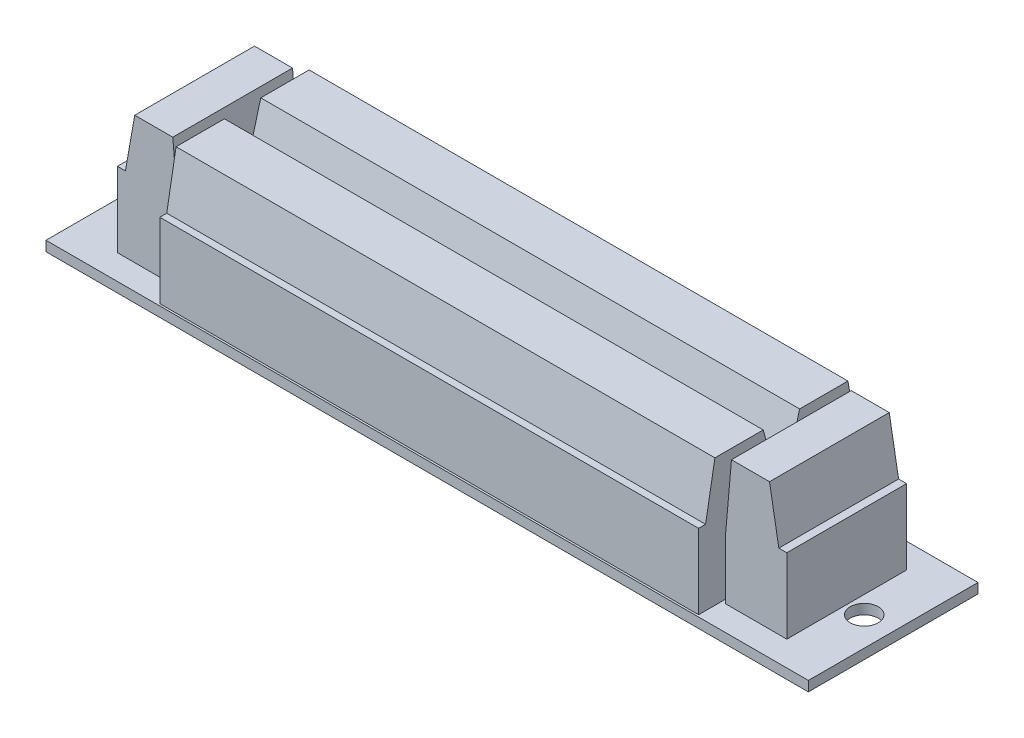
ISO-10303-21;
HEADER;
FILE_DESCRIPTION(('STEP AP214'),'2;1');
FILE_NAME('part.step','',(''),(''),'','','');
FILE_SCHEMA(('AUTOMOTIVE_DESIGN { 1 0 10303 214 1 1 1 1 }'));
ENDSEC;
DATA;
#1=APPLICATION_CONTEXT('core data for automotive mechanical design processes');
#2=APPLICATION_PROTOCOL_DEFINITION('international standard','automotive_design',2000,#1);
#3=PRODUCT_CONTEXT('',#1,'mechanical');
#4=PRODUCT('Part','Part','',(#3));
#5=PRODUCT_RELATED_PRODUCT_CATEGORY('part','',(#4));
#6=PRODUCT_DEFINITION_FORMATION('','',#4);
#7=PRODUCT_DEFINITION_CONTEXT('part definition',#1,'design');
#8=PRODUCT_DEFINITION('design','',#6,#7);
#9=PRODUCT_DEFINITION_SHAPE('','',#8);
#10=(LENGTH_UNIT() NAMED_UNIT(*) SI_UNIT(.MILLI.,.METRE.));
#11=(NAMED_UNIT(*) PLANE_ANGLE_UNIT() SI_UNIT($,.RADIAN.));
#12=(NAMED_UNIT(*) SI_UNIT($,.STERADIAN.) SOLID_ANGLE_UNIT());
#13=UNCERTAINTY_MEASURE_WITH_UNIT(LENGTH_MEASURE(1.E-05),#10,'distance_accuracy_value','');
#14=(GEOMETRIC_REPRESENTATION_CONTEXT(3) GLOBAL_UNCERTAINTY_ASSIGNED_CONTEXT((#13)) GLOBAL_UNIT_ASSIGNED_CONTEXT((#10,
#11,#12)) REPRESENTATION_CONTEXT('',''));
#15=CARTESIAN_POINT('',(0.,0.,0.));
#16=DIRECTION('',(0.,0.,1.));
#17=DIRECTION('',(1.,0.,0.));
#18=AXIS2_PLACEMENT_3D('',#15,#16,#17);
#19=CARTESIAN_POINT('',(0.,0.635,0.));
#20=DIRECTION('',(0.,1.,0.));
#21=DIRECTION('',(0.,0.,1.));
#22=AXIS2_PLACEMENT_3D('',#19,#20,#21);
#23=PLANE('',#22);
#24=DIRECTION('',(-1.,0.,0.));
#25=VECTOR('',#24,1.);
#26=CARTESIAN_POINT('',(42.5964285544107,0.635,7.62));
#27=LINE('',#26,#25);
#28=CARTESIAN_POINT('',(42.5964285544107,0.635,7.62));
#29=VERTEX_POINT('',#28);
#30=CARTESIAN_POINT('',(34.798,0.635,7.62));
#31=VERTEX_POINT('',#30);
#32=EDGE_CURVE('E245',#29,#31,#27,.T.);
#33=ORIENTED_EDGE('',*,*,#32,.T.);
#34=DIRECTION('',(0.,0.,-1.));
#35=VECTOR('',#34,1.);
#36=CARTESIAN_POINT('',(34.798,0.635,7.62));
#37=LINE('',#36,#35);
#38=CARTESIAN_POINT('',(34.798,0.635,-7.62));
#39=VERTEX_POINT('',#38);
#40=EDGE_CURVE('E1044',#31,#39,#37,.T.);
#41=ORIENTED_EDGE('',*,*,#40,.T.);
#42=DIRECTION('',(-1.,0.,0.));
#43=VECTOR('',#42,1.);
#44=CARTESIAN_POINT('',(42.5964285544107,0.635,-7.62));
#45=LINE('',#44,#43);
#46=CARTESIAN_POINT('',(42.5964285544107,0.635,-7.62));
#47=VERTEX_POINT('',#46);
#48=EDGE_CURVE('E269',#47,#39,#45,.T.);
#49=ORIENTED_EDGE('',*,*,#48,.F.);
#50=DIRECTION('',(0.,0.,-1.));
#51=VECTOR('',#50,1.);
#52=CARTESIAN_POINT('',(42.5964285544107,0.635,7.62));
#53=LINE('',#52,#51);
#54=EDGE_CURVE('E262',#29,#47,#53,.T.);
#55=ORIENTED_EDGE('',*,*,#54,.F.);
#56=EDGE_LOOP('',(#33,#41,#49,#55));
#57=FACE_BOUND('',#56,.T.);
#58=DIRECTION('',(1.,0.,0.));
#59=VECTOR('',#58,1.);
#60=CARTESIAN_POINT('',(-42.5964285544107,0.635,7.62));
#61=LINE('',#60,#59);
#62=CARTESIAN_POINT('',(-42.5964285544107,0.635,7.62));
#63=VERTEX_POINT('',#62);
#64=CARTESIAN_POINT('',(-34.798,0.635,7.62));
#65=VERTEX_POINT('',#64);
#66=EDGE_CURVE('E282',#63,#65,#61,.T.);
#67=ORIENTED_EDGE('',*,*,#66,.F.);
#68=DIRECTION('',(0.,0.,-1.));
#69=VECTOR('',#68,1.);
#70=CARTESIAN_POINT('',(-42.5964285544107,0.635,7.62));
#71=LINE('',#70,#69);
#72=CARTESIAN_POINT('',(-42.5964285544107,0.635,-7.62));
#73=VERTEX_POINT('',#72);
#74=EDGE_CURVE('E304',#63,#73,#71,.T.);
#75=ORIENTED_EDGE('',*,*,#74,.T.);
#76=DIRECTION('',(1.,0.,0.));
#77=VECTOR('',#76,1.);
#78=CARTESIAN_POINT('',(-42.5964285544107,0.635,-7.62));
#79=LINE('',#78,#77);
#80=CARTESIAN_POINT('',(-34.798,0.635,-7.62));
#81=VERTEX_POINT('',#80);
#82=EDGE_CURVE('E271',#73,#81,#79,.T.);
#83=ORIENTED_EDGE('',*,*,#82,.T.);
#84=DIRECTION('',(0.,0.,-1.));
#85=VECTOR('',#84,1.);
#86=CARTESIAN_POINT('',(-34.798,0.635,7.62));
#87=LINE('',#86,#85);
#88=EDGE_CURVE('E75',#65,#81,#87,.T.);
#89=ORIENTED_EDGE('',*,*,#88,.F.);
#90=EDGE_LOOP('',(#67,#75,#83,#89));
#91=FACE_BOUND('',#90,.T.);
#92=CARTESIAN_POINT('',(-44.831,0.635,0.));
#93=DIRECTION('',(0.,1.,0.));
#94=DIRECTION('',(0.,0.,1.));
#95=AXIS2_PLACEMENT_3D('',#92,#93,#94);
#96=CIRCLE('',#95,1.778);
#97=CARTESIAN_POINT('',(-44.831,0.635,1.778));
#98=VERTEX_POINT('',#97);
#99=EDGE_CURVE('E468',#98,#98,#96,.T.);
#100=ORIENTED_EDGE('',*,*,#99,.F.);
#101=EDGE_LOOP('',(#100));
#102=FACE_BOUND('',#101,.T.);
#103=DIRECTION('',(0.,0.,-1.));
#104=VECTOR('',#103,1.);
#105=CARTESIAN_POINT('',(48.514,0.635,-10.795));
#106=LINE('',#105,#104);
#107=CARTESIAN_POINT('',(48.514,0.635,10.795));
#108=VERTEX_POINT('',#107);
#109=CARTESIAN_POINT('',(48.514,0.635,-10.795));
#110=VERTEX_POINT('',#109);
#111=EDGE_CURVE('E476',#108,#110,#106,.T.);
#112=ORIENTED_EDGE('',*,*,#111,.T.);
#113=DIRECTION('',(-1.,0.,0.));
#114=VECTOR('',#113,1.);
#115=CARTESIAN_POINT('',(-48.514,0.635,-10.795));
#116=LINE('',#115,#114);
#117=CARTESIAN_POINT('',(-48.514,0.635,-10.795));
#118=VERTEX_POINT('',#117);
#119=EDGE_CURVE('E480',#110,#118,#116,.T.);
#120=ORIENTED_EDGE('',*,*,#119,.T.);
#121=DIRECTION('',(0.,0.,1.));
#122=VECTOR('',#121,1.);
#123=CARTESIAN_POINT('',(-48.514,0.635,-10.795));
#124=LINE('',#123,#122);
#125=CARTESIAN_POINT('',(-48.514,0.635,10.795));
#126=VERTEX_POINT('',#125);
#127=EDGE_CURVE('E484',#118,#126,#124,.T.);
#128=ORIENTED_EDGE('',*,*,#127,.T.);
#129=DIRECTION('',(1.,0.,0.));
#130=VECTOR('',#129,1.);
#131=CARTESIAN_POINT('',(-48.514,0.635,10.795));
#132=LINE('',#131,#130);
#133=EDGE_CURVE('E487',#126,#108,#132,.T.);
#134=ORIENTED_EDGE('',*,*,#133,.T.);
#135=EDGE_LOOP('',(#112,#120,#128,#134));
#136=FACE_BOUND('',#135,.T.);
#137=CARTESIAN_POINT('',(44.831,0.635,0.));
#138=DIRECTION('',(0.,1.,0.));
#139=DIRECTION('',(0.,0.,-1.));
#140=AXIS2_PLACEMENT_3D('',#137,#138,#139);
#141=CIRCLE('',#140,1.778);
#142=CARTESIAN_POINT('',(44.831,0.635,-1.77800000000001));
#143=VERTEX_POINT('',#142);
#144=EDGE_CURVE('E460',#143,#143,#141,.T.);
#145=ORIENTED_EDGE('',*,*,#144,.F.);
#146=EDGE_LOOP('',(#145));
#147=FACE_BOUND('',#146,.T.);
#148=DIRECTION('',(-1.,0.,0.));
#149=VECTOR('',#148,1.);
#150=CARTESIAN_POINT('',(34.29,0.635000000000003,-10.541));
#151=LINE('',#150,#149);
#152=CARTESIAN_POINT('',(34.29,0.635,-10.541));
#153=VERTEX_POINT('',#152);
#154=CARTESIAN_POINT('',(-34.29,0.635,-10.541));
#155=VERTEX_POINT('',#154);
#156=EDGE_CURVE('E455',#153,#155,#151,.T.);
#157=ORIENTED_EDGE('',*,*,#156,.F.);
#158=DIRECTION('',(0.,0.,-1.));
#159=VECTOR('',#158,1.);
#160=CARTESIAN_POINT('',(34.29,0.635000000000003,-10.541));
#161=LINE('',#160,#159);
#162=CARTESIAN_POINT('',(34.29,0.635,10.541));
#163=VERTEX_POINT('',#162);
#164=EDGE_CURVE('E348',#163,#153,#161,.T.);
#165=ORIENTED_EDGE('',*,*,#164,.F.);
#166=DIRECTION('',(-1.,0.,0.));
#167=VECTOR('',#166,1.);
#168=CARTESIAN_POINT('',(34.29,0.635,10.541));
#169=LINE('',#168,#167);
#170=CARTESIAN_POINT('',(-34.29,0.635,10.541));
#171=VERTEX_POINT('',#170);
#172=EDGE_CURVE('E384',#163,#171,#169,.T.);
#173=ORIENTED_EDGE('',*,*,#172,.T.);
#174=DIRECTION('',(0.,0.,-1.));
#175=VECTOR('',#174,1.);
#176=CARTESIAN_POINT('',(-34.29,0.635000000000003,-10.541));
#177=LINE('',#176,#175);
#178=EDGE_CURVE('E347',#171,#155,#177,.T.);
#179=ORIENTED_EDGE('',*,*,#178,.T.);
#180=EDGE_LOOP('',(#157,#165,#173,#179));
#181=FACE_BOUND('',#180,.T.);
#182=ADVANCED_FACE('F51',(#57,#91,#102,#136,#147,#181),#23,.T.);
#183=CARTESIAN_POINT('',(0.,-0.635,0.));
#184=DIRECTION('',(0.,1.,0.));
#185=DIRECTION('',(0.,0.,1.));
#186=AXIS2_PLACEMENT_3D('',#183,#184,#185);
#187=PLANE('',#186);
#188=DIRECTION('',(0.,0.,-1.));
#189=VECTOR('',#188,1.);
#190=CARTESIAN_POINT('',(48.514,-0.635,-10.795));
#191=LINE('',#190,#189);
#192=CARTESIAN_POINT('',(48.514,-0.635,10.795));
#193=VERTEX_POINT('',#192);
#194=CARTESIAN_POINT('',(48.514,-0.635,-10.795));
#195=VERTEX_POINT('',#194);
#196=EDGE_CURVE('E472',#193,#195,#191,.T.);
#197=ORIENTED_EDGE('',*,*,#196,.F.);
#198=DIRECTION('',(1.,0.,0.));
#199=VECTOR('',#198,1.);
#200=CARTESIAN_POINT('',(-48.514,-0.635,10.795));
#201=LINE('',#200,#199);
#202=CARTESIAN_POINT('',(-48.514,-0.635,10.795));
#203=VERTEX_POINT('',#202);
#204=EDGE_CURVE('E481',#203,#193,#201,.T.);
#205=ORIENTED_EDGE('',*,*,#204,.F.);
#206=DIRECTION('',(0.,0.,1.));
#207=VECTOR('',#206,1.);
#208=CARTESIAN_POINT('',(-48.514,-0.635,-10.795));
#209=LINE('',#208,#207);
#210=CARTESIAN_POINT('',(-48.514,-0.635,-10.795));
#211=VERTEX_POINT('',#210);
#212=EDGE_CURVE('E497',#211,#203,#209,.T.);
#213=ORIENTED_EDGE('',*,*,#212,.F.);
#214=DIRECTION('',(-1.,0.,0.));
#215=VECTOR('',#214,1.);
#216=CARTESIAN_POINT('',(-48.514,-0.635,-10.795));
#217=LINE('',#216,#215);
#218=EDGE_CURVE('E494',#195,#211,#217,.T.);
#219=ORIENTED_EDGE('',*,*,#218,.F.);
#220=EDGE_LOOP('',(#197,#205,#213,#219));
#221=FACE_BOUND('',#220,.T.);
#222=CARTESIAN_POINT('',(-44.831,-0.635,0.));
#223=DIRECTION('',(0.,1.,0.));
#224=DIRECTION('',(0.,0.,1.));
#225=AXIS2_PLACEMENT_3D('',#222,#223,#224);
#226=CIRCLE('',#225,1.778);
#227=CARTESIAN_POINT('',(-44.831,-0.635,1.778));
#228=VERTEX_POINT('',#227);
#229=EDGE_CURVE('E464',#228,#228,#226,.T.);
#230=ORIENTED_EDGE('',*,*,#229,.T.);
#231=EDGE_LOOP('',(#230));
#232=FACE_BOUND('',#231,.T.);
#233=CARTESIAN_POINT('',(44.831,-0.635,0.));
#234=DIRECTION('',(0.,1.,0.));
#235=DIRECTION('',(0.,0.,-1.));
#236=AXIS2_PLACEMENT_3D('',#233,#234,#235);
#237=CIRCLE('',#236,1.778);
#238=CARTESIAN_POINT('',(44.831,-0.635,-1.77800000000001));
#239=VERTEX_POINT('',#238);
#240=EDGE_CURVE('E459',#239,#239,#237,.T.);
#241=ORIENTED_EDGE('',*,*,#240,.T.);
#242=EDGE_LOOP('',(#241));
#243=FACE_BOUND('',#242,.T.);
#244=ADVANCED_FACE('F520',(#221,#232,#243),#187,.F.);
#245=CARTESIAN_POINT('',(48.514,0.635,-10.795));
#246=DIRECTION('',(-1.,0.,0.));
#247=DIRECTION('',(0.,0.,1.));
#248=AXIS2_PLACEMENT_3D('',#245,#246,#247);
#249=PLANE('',#248);
#250=ORIENTED_EDGE('',*,*,#196,.T.);
#251=DIRECTION('',(0.,-1.,0.));
#252=VECTOR('',#251,1.);
#253=CARTESIAN_POINT('',(48.514,0.635,-10.795));
#254=LINE('',#253,#252);
#255=EDGE_CURVE('E11',#110,#195,#254,.T.);
#256=ORIENTED_EDGE('',*,*,#255,.F.);
#257=ORIENTED_EDGE('',*,*,#111,.F.);
#258=DIRECTION('',(0.,-1.,0.));
#259=VECTOR('',#258,1.);
#260=CARTESIAN_POINT('',(48.514,0.635,10.795));
#261=LINE('',#260,#259);
#262=EDGE_CURVE('E490',#108,#193,#261,.T.);
#263=ORIENTED_EDGE('',*,*,#262,.T.);
#264=EDGE_LOOP('',(#250,#256,#257,#263));
#265=FACE_BOUND('',#264,.T.);
#266=ADVANCED_FACE('F53',(#265),#249,.F.);
#267=CARTESIAN_POINT('',(-48.514,0.635,-10.795));
#268=DIRECTION('',(0.,0.,1.));
#269=DIRECTION('',(1.,0.,0.));
#270=AXIS2_PLACEMENT_3D('',#267,#268,#269);
#271=PLANE('',#270);
#272=ORIENTED_EDGE('',*,*,#218,.T.);
#273=DIRECTION('',(0.,-1.,0.));
#274=VECTOR('',#273,1.);
#275=CARTESIAN_POINT('',(-48.514,0.635,-10.795));
#276=LINE('',#275,#274);
#277=EDGE_CURVE('E60',#118,#211,#276,.T.);
#278=ORIENTED_EDGE('',*,*,#277,.F.);
#279=ORIENTED_EDGE('',*,*,#119,.F.);
#280=ORIENTED_EDGE('',*,*,#255,.T.);
#281=EDGE_LOOP('',(#272,#278,#279,#280));
#282=FACE_BOUND('',#281,.T.);
#283=ADVANCED_FACE('F531',(#282),#271,.F.);
#284=CARTESIAN_POINT('',(-48.514,0.635,-10.795));
#285=DIRECTION('',(1.,0.,0.));
#286=DIRECTION('',(0.,0.,-1.));
#287=AXIS2_PLACEMENT_3D('',#284,#285,#286);
#288=PLANE('',#287);
#289=ORIENTED_EDGE('',*,*,#212,.T.);
#290=DIRECTION('',(0.,-1.,0.));
#291=VECTOR('',#290,1.);
#292=CARTESIAN_POINT('',(-48.514,0.635,10.795));
#293=LINE('',#292,#291);
#294=EDGE_CURVE('E505',#126,#203,#293,.T.);
#295=ORIENTED_EDGE('',*,*,#294,.F.);
#296=ORIENTED_EDGE('',*,*,#127,.F.);
#297=ORIENTED_EDGE('',*,*,#277,.T.);
#298=EDGE_LOOP('',(#289,#295,#296,#297));
#299=FACE_BOUND('',#298,.T.);
#300=ADVANCED_FACE('F514',(#299),#288,.F.);
#301=CARTESIAN_POINT('',(-48.514,0.635,10.795));
#302=DIRECTION('',(0.,0.,-1.));
#303=DIRECTION('',(-1.,0.,0.));
#304=AXIS2_PLACEMENT_3D('',#301,#302,#303);
#305=PLANE('',#304);
#306=ORIENTED_EDGE('',*,*,#204,.T.);
#307=ORIENTED_EDGE('',*,*,#262,.F.);
#308=ORIENTED_EDGE('',*,*,#133,.F.);
#309=ORIENTED_EDGE('',*,*,#294,.T.);
#310=EDGE_LOOP('',(#306,#307,#308,#309));
#311=FACE_BOUND('',#310,.T.);
#312=ADVANCED_FACE('F524',(#311),#305,.F.);
#313=CARTESIAN_POINT('',(-44.831,0.635,0.));
#314=DIRECTION('',(0.,-1.,0.));
#315=DIRECTION('',(0.,0.,-1.));
#316=AXIS2_PLACEMENT_3D('',#313,#314,#315);
#317=CYLINDRICAL_SURFACE('',#316,1.778);
#318=ORIENTED_EDGE('',*,*,#99,.T.);
#319=EDGE_LOOP('',(#318));
#320=FACE_BOUND('',#319,.T.);
#321=ORIENTED_EDGE('',*,*,#229,.F.);
#322=EDGE_LOOP('',(#321));
#323=FACE_BOUND('',#322,.T.);
#324=ADVANCED_FACE('F545',(#320,#323),#317,.F.);
#325=CARTESIAN_POINT('',(44.831,0.635,0.));
#326=DIRECTION('',(0.,-1.,0.));
#327=DIRECTION('',(0.,0.,-1.));
#328=AXIS2_PLACEMENT_3D('',#325,#326,#327);
#329=CYLINDRICAL_SURFACE('',#328,1.778);
#330=ORIENTED_EDGE('',*,*,#144,.T.);
#331=EDGE_LOOP('',(#330));
#332=FACE_BOUND('',#331,.T.);
#333=ORIENTED_EDGE('',*,*,#240,.F.);
#334=EDGE_LOOP('',(#333));
#335=FACE_BOUND('',#334,.T.);
#336=ADVANCED_FACE('F552',(#332,#335),#329,.F.);
#337=CARTESIAN_POINT('',(34.29,0.635000000000003,-10.541));
#338=DIRECTION('',(0.,0.,1.));
#339=DIRECTION('',(0.,-1.,0.));
#340=AXIS2_PLACEMENT_3D('',#337,#338,#339);
#341=PLANE('',#340);
#342=DIRECTION('',(0.,1.,0.));
#343=VECTOR('',#342,1.);
#344=CARTESIAN_POINT('',(-34.29,0.635000000000003,-10.541));
#345=LINE('',#344,#343);
#346=CARTESIAN_POINT('',(-34.29,10.16,-10.541));
#347=VERTEX_POINT('',#346);
#348=EDGE_CURVE('E387',#155,#347,#345,.T.);
#349=ORIENTED_EDGE('',*,*,#348,.T.);
#350=DIRECTION('',(-1.,0.,0.));
#351=VECTOR('',#350,1.);
#352=CARTESIAN_POINT('',(34.29,10.16,-10.541));
#353=LINE('',#352,#351);
#354=CARTESIAN_POINT('',(34.29,10.16,-10.541));
#355=VERTEX_POINT('',#354);
#356=EDGE_CURVE('E451',#355,#347,#353,.T.);
#357=ORIENTED_EDGE('',*,*,#356,.F.);
#358=DIRECTION('',(0.,1.,0.));
#359=VECTOR('',#358,1.);
#360=CARTESIAN_POINT('',(34.29,0.635000000000003,-10.541));
#361=LINE('',#360,#359);
#362=EDGE_CURVE('E352',#153,#355,#361,.T.);
#363=ORIENTED_EDGE('',*,*,#362,.F.);
#364=ORIENTED_EDGE('',*,*,#156,.T.);
#365=EDGE_LOOP('',(#349,#357,#363,#364));
#366=FACE_BOUND('',#365,.T.);
#367=ADVANCED_FACE('F557',(#366),#341,.F.);
#368=CARTESIAN_POINT('',(34.29,10.16,-10.541));
#369=DIRECTION('',(0.,-1.,0.));
#370=DIRECTION('',(0.,0.,-1.));
#371=AXIS2_PLACEMENT_3D('',#368,#369,#370);
#372=PLANE('',#371);
#373=DIRECTION('',(0.,0.,1.));
#374=VECTOR('',#373,1.);
#375=CARTESIAN_POINT('',(-34.29,10.16,-10.541));
#376=LINE('',#375,#374);
#377=CARTESIAN_POINT('',(-34.29,10.16,-9.652));
#378=VERTEX_POINT('',#377);
#379=EDGE_CURVE('E390',#347,#378,#376,.T.);
#380=ORIENTED_EDGE('',*,*,#379,.T.);
#381=DIRECTION('',(-1.,0.,0.));
#382=VECTOR('',#381,1.);
#383=CARTESIAN_POINT('',(34.29,10.16,-9.652));
#384=LINE('',#383,#382);
#385=CARTESIAN_POINT('',(34.29,10.16,-9.652));
#386=VERTEX_POINT('',#385);
#387=EDGE_CURVE('E447',#386,#378,#384,.T.);
#388=ORIENTED_EDGE('',*,*,#387,.F.);
#389=DIRECTION('',(0.,0.,1.));
#390=VECTOR('',#389,1.);
#391=CARTESIAN_POINT('',(34.29,10.16,-10.541));
#392=LINE('',#391,#390);
#393=EDGE_CURVE('E356',#355,#386,#392,.T.);
#394=ORIENTED_EDGE('',*,*,#393,.F.);
#395=ORIENTED_EDGE('',*,*,#356,.T.);
#396=EDGE_LOOP('',(#380,#388,#394,#395));
#397=FACE_BOUND('',#396,.T.);
#398=ADVANCED_FACE('F569',(#397),#372,.F.);
#399=CARTESIAN_POINT('',(34.29,10.16,-9.652));
#400=DIRECTION('',(0.,-0.173648177666927,0.984807753012209));
#401=DIRECTION('',(0.,-0.984807753012209,-0.173648177666927));
#402=AXIS2_PLACEMENT_3D('',#399,#400,#401);
#403=PLANE('',#402);
#404=DIRECTION('',(0.,0.984807753012209,0.173648177666927));
#405=VECTOR('',#404,1.);
#406=CARTESIAN_POINT('',(-34.29,10.16,-9.652));
#407=LINE('',#406,#405);
#408=CARTESIAN_POINT('',(-34.29,16.891,-8.46514309285134));
#409=VERTEX_POINT('',#408);
#410=EDGE_CURVE('E393',#378,#409,#407,.T.);
#411=ORIENTED_EDGE('',*,*,#410,.T.);
#412=DIRECTION('',(-1.,0.,0.));
#413=VECTOR('',#412,1.);
#414=CARTESIAN_POINT('',(34.29,16.891,-8.46514309285134));
#415=LINE('',#414,#413);
#416=CARTESIAN_POINT('',(34.29,16.891,-8.46514309285134));
#417=VERTEX_POINT('',#416);
#418=EDGE_CURVE('E443',#417,#409,#415,.T.);
#419=ORIENTED_EDGE('',*,*,#418,.F.);
#420=DIRECTION('',(0.,0.984807753012209,0.173648177666927));
#421=VECTOR('',#420,1.);
#422=CARTESIAN_POINT('',(34.29,10.16,-9.652));
#423=LINE('',#422,#421);
#424=EDGE_CURVE('E359',#386,#417,#423,.T.);
#425=ORIENTED_EDGE('',*,*,#424,.F.);
#426=ORIENTED_EDGE('',*,*,#387,.T.);
#427=EDGE_LOOP('',(#411,#419,#425,#426));
#428=FACE_BOUND('',#427,.T.);
#429=ADVANCED_FACE('F575',(#428),#403,.F.);
#430=CARTESIAN_POINT('',(34.29,16.891,-8.46514309285134));
#431=DIRECTION('',(0.,-1.,0.));
#432=DIRECTION('',(0.,0.,-1.));
#433=AXIS2_PLACEMENT_3D('',#430,#431,#432);
#434=PLANE('',#433);
#435=DIRECTION('',(0.,0.,1.));
#436=VECTOR('',#435,1.);
#437=CARTESIAN_POINT('',(-34.29,16.891,-8.46514309285134));
#438=LINE('',#437,#436);
#439=CARTESIAN_POINT('',(-34.29,16.891,-2.31400922583518));
#440=VERTEX_POINT('',#439);
#441=EDGE_CURVE('E396',#409,#440,#438,.T.);
#442=ORIENTED_EDGE('',*,*,#441,.T.);
#443=DIRECTION('',(-1.,0.,0.));
#444=VECTOR('',#443,1.);
#445=CARTESIAN_POINT('',(34.29,16.891,-2.31400922583518));
#446=LINE('',#445,#444);
#447=CARTESIAN_POINT('',(34.29,16.891,-2.31400922583518));
#448=VERTEX_POINT('',#447);
#449=EDGE_CURVE('E439',#448,#440,#446,.T.);
#450=ORIENTED_EDGE('',*,*,#449,.F.);
#451=DIRECTION('',(0.,0.,1.));
#452=VECTOR('',#451,1.);
#453=CARTESIAN_POINT('',(34.29,16.891,-8.46514309285134));
#454=LINE('',#453,#452);
#455=EDGE_CURVE('E362',#417,#448,#454,.T.);
#456=ORIENTED_EDGE('',*,*,#455,.F.);
#457=ORIENTED_EDGE('',*,*,#418,.T.);
#458=EDGE_LOOP('',(#442,#450,#456,#457));
#459=FACE_BOUND('',#458,.T.);
#460=ADVANCED_FACE('F579',(#459),#434,.F.);
#461=CARTESIAN_POINT('',(34.29,16.891,-2.31400922583518));
#462=DIRECTION('',(0.,-0.258819045102521,-0.965925826289068));
#463=DIRECTION('',(0.,0.965925826289068,-0.258819045102521));
#464=AXIS2_PLACEMENT_3D('',#461,#462,#463);
#465=PLANE('',#464);
#466=DIRECTION('',(0.,-0.965925826289068,0.258819045102521));
#467=VECTOR('',#466,1.);
#468=CARTESIAN_POINT('',(-34.29,16.891,-2.31400922583518));
#469=LINE('',#468,#467);
#470=CARTESIAN_POINT('',(-34.29,8.255,0.));
#471=VERTEX_POINT('',#470);
#472=EDGE_CURVE('E399',#440,#471,#469,.T.);
#473=ORIENTED_EDGE('',*,*,#472,.T.);
#474=DIRECTION('',(-1.,0.,0.));
#475=VECTOR('',#474,1.);
#476=CARTESIAN_POINT('',(34.29,8.255,0.));
#477=LINE('',#476,#475);
#478=CARTESIAN_POINT('',(34.29,8.255,0.));
#479=VERTEX_POINT('',#478);
#480=EDGE_CURVE('E435',#479,#471,#477,.T.);
#481=ORIENTED_EDGE('',*,*,#480,.F.);
#482=DIRECTION('',(0.,-0.965925826289068,0.258819045102521));
#483=VECTOR('',#482,1.);
#484=CARTESIAN_POINT('',(34.29,16.891,-2.31400922583518));
#485=LINE('',#484,#483);
#486=EDGE_CURVE('E365',#448,#479,#485,.T.);
#487=ORIENTED_EDGE('',*,*,#486,.F.);
#488=ORIENTED_EDGE('',*,*,#449,.T.);
#489=EDGE_LOOP('',(#473,#481,#487,#488));
#490=FACE_BOUND('',#489,.T.);
#491=ADVANCED_FACE('F583',(#490),#465,.F.);
#492=CARTESIAN_POINT('',(34.29,16.891,2.31400922583519));
#493=DIRECTION('',(0.,-0.258819045102522,0.965925826289068));
#494=DIRECTION('',(0.,-0.965925826289068,-0.258819045102522));
#495=AXIS2_PLACEMENT_3D('',#492,#493,#494);
#496=PLANE('',#495);
#497=DIRECTION('',(0.,0.965925826289068,0.258819045102522));
#498=VECTOR('',#497,1.);
#499=CARTESIAN_POINT('',(-34.29,16.891,2.31400922583519));
#500=LINE('',#499,#498);
#501=CARTESIAN_POINT('',(-34.29,16.891,2.31400922583519));
#502=VERTEX_POINT('',#501);
#503=EDGE_CURVE('E402',#471,#502,#500,.T.);
#504=ORIENTED_EDGE('',*,*,#503,.T.);
#505=DIRECTION('',(-1.,0.,0.));
#506=VECTOR('',#505,1.);
#507=CARTESIAN_POINT('',(34.29,16.891,2.31400922583519));
#508=LINE('',#507,#506);
#509=CARTESIAN_POINT('',(34.29,16.891,2.31400922583519));
#510=VERTEX_POINT('',#509);
#511=EDGE_CURVE('E431',#510,#502,#508,.T.);
#512=ORIENTED_EDGE('',*,*,#511,.F.);
#513=DIRECTION('',(0.,0.965925826289068,0.258819045102522));
#514=VECTOR('',#513,1.);
#515=CARTESIAN_POINT('',(34.29,16.891,2.31400922583519));
#516=LINE('',#515,#514);
#517=EDGE_CURVE('E368',#479,#510,#516,.T.);
#518=ORIENTED_EDGE('',*,*,#517,.F.);
#519=ORIENTED_EDGE('',*,*,#480,.T.);
#520=EDGE_LOOP('',(#504,#512,#518,#519));
#521=FACE_BOUND('',#520,.T.);
#522=ADVANCED_FACE('F587',(#521),#496,.F.);
#523=CARTESIAN_POINT('',(34.29,16.891,8.46514309285135));
#524=DIRECTION('',(0.,-1.,0.));
#525=DIRECTION('',(0.,0.,-1.));
#526=AXIS2_PLACEMENT_3D('',#523,#524,#525);
#527=PLANE('',#526);
#528=DIRECTION('',(0.,0.,1.));
#529=VECTOR('',#528,1.);
#530=CARTESIAN_POINT('',(-34.29,16.891,8.46514309285135));
#531=LINE('',#530,#529);
#532=CARTESIAN_POINT('',(-34.29,16.891,8.46514309285135));
#533=VERTEX_POINT('',#532);
#534=EDGE_CURVE('E405',#502,#533,#531,.T.);
#535=ORIENTED_EDGE('',*,*,#534,.T.);
#536=DIRECTION('',(-1.,0.,0.));
#537=VECTOR('',#536,1.);
#538=CARTESIAN_POINT('',(34.29,16.891,8.46514309285135));
#539=LINE('',#538,#537);
#540=CARTESIAN_POINT('',(34.29,16.891,8.46514309285135));
#541=VERTEX_POINT('',#540);
#542=EDGE_CURVE('E427',#541,#533,#539,.T.);
#543=ORIENTED_EDGE('',*,*,#542,.F.);
#544=DIRECTION('',(0.,0.,1.));
#545=VECTOR('',#544,1.);
#546=CARTESIAN_POINT('',(34.29,16.891,8.46514309285135));
#547=LINE('',#546,#545);
#548=EDGE_CURVE('E371',#510,#541,#547,.T.);
#549=ORIENTED_EDGE('',*,*,#548,.F.);
#550=ORIENTED_EDGE('',*,*,#511,.T.);
#551=EDGE_LOOP('',(#535,#543,#549,#550));
#552=FACE_BOUND('',#551,.T.);
#553=ADVANCED_FACE('F591',(#552),#527,.F.);
#554=CARTESIAN_POINT('',(34.29,10.16,9.652));
#555=DIRECTION('',(0.,-0.173648177666926,-0.984807753012209));
#556=DIRECTION('',(0.,0.984807753012209,-0.173648177666926));
#557=AXIS2_PLACEMENT_3D('',#554,#555,#556);
#558=PLANE('',#557);
#559=DIRECTION('',(0.,-0.984807753012209,0.173648177666926));
#560=VECTOR('',#559,1.);
#561=CARTESIAN_POINT('',(-34.29,10.16,9.652));
#562=LINE('',#561,#560);
#563=CARTESIAN_POINT('',(-34.29,10.16,9.652));
#564=VERTEX_POINT('',#563);
#565=EDGE_CURVE('E408',#533,#564,#562,.T.);
#566=ORIENTED_EDGE('',*,*,#565,.T.);
#567=DIRECTION('',(-1.,0.,0.));
#568=VECTOR('',#567,1.);
#569=CARTESIAN_POINT('',(34.29,10.16,9.652));
#570=LINE('',#569,#568);
#571=CARTESIAN_POINT('',(34.29,10.16,9.652));
#572=VERTEX_POINT('',#571);
#573=EDGE_CURVE('E423',#572,#564,#570,.T.);
#574=ORIENTED_EDGE('',*,*,#573,.F.);
#575=DIRECTION('',(0.,-0.984807753012209,0.173648177666926));
#576=VECTOR('',#575,1.);
#577=CARTESIAN_POINT('',(34.29,10.16,9.652));
#578=LINE('',#577,#576);
#579=EDGE_CURVE('E374',#541,#572,#578,.T.);
#580=ORIENTED_EDGE('',*,*,#579,.F.);
#581=ORIENTED_EDGE('',*,*,#542,.T.);
#582=EDGE_LOOP('',(#566,#574,#580,#581));
#583=FACE_BOUND('',#582,.T.);
#584=ADVANCED_FACE('F595',(#583),#558,.F.);
#585=CARTESIAN_POINT('',(34.29,10.16,10.541));
#586=DIRECTION('',(0.,-1.,0.));
#587=DIRECTION('',(0.,0.,-1.));
#588=AXIS2_PLACEMENT_3D('',#585,#586,#587);
#589=PLANE('',#588);
#590=DIRECTION('',(0.,0.,1.));
#591=VECTOR('',#590,1.);
#592=CARTESIAN_POINT('',(-34.29,10.16,10.541));
#593=LINE('',#592,#591);
#594=CARTESIAN_POINT('',(-34.29,10.16,10.541));
#595=VERTEX_POINT('',#594);
#596=EDGE_CURVE('E411',#564,#595,#593,.T.);
#597=ORIENTED_EDGE('',*,*,#596,.T.);
#598=DIRECTION('',(-1.,0.,0.));
#599=VECTOR('',#598,1.);
#600=CARTESIAN_POINT('',(34.29,10.16,10.541));
#601=LINE('',#600,#599);
#602=CARTESIAN_POINT('',(34.29,10.16,10.541));
#603=VERTEX_POINT('',#602);
#604=EDGE_CURVE('E419',#603,#595,#601,.T.);
#605=ORIENTED_EDGE('',*,*,#604,.F.);
#606=DIRECTION('',(0.,0.,1.));
#607=VECTOR('',#606,1.);
#608=CARTESIAN_POINT('',(34.29,10.16,10.541));
#609=LINE('',#608,#607);
#610=EDGE_CURVE('E377',#572,#603,#609,.T.);
#611=ORIENTED_EDGE('',*,*,#610,.F.);
#612=ORIENTED_EDGE('',*,*,#573,.T.);
#613=EDGE_LOOP('',(#597,#605,#611,#612));
#614=FACE_BOUND('',#613,.T.);
#615=ADVANCED_FACE('F599',(#614),#589,.F.);
#616=CARTESIAN_POINT('',(34.29,0.635,10.541));
#617=DIRECTION('',(0.,0.,-1.));
#618=DIRECTION('',(0.,1.,0.));
#619=AXIS2_PLACEMENT_3D('',#616,#617,#618);
#620=PLANE('',#619);
#621=DIRECTION('',(0.,-1.,0.));
#622=VECTOR('',#621,1.);
#623=CARTESIAN_POINT('',(-34.29,0.635,10.541));
#624=LINE('',#623,#622);
#625=EDGE_CURVE('E353',#595,#171,#624,.T.);
#626=ORIENTED_EDGE('',*,*,#625,.T.);
#627=ORIENTED_EDGE('',*,*,#172,.F.);
#628=DIRECTION('',(0.,-1.,0.));
#629=VECTOR('',#628,1.);
#630=CARTESIAN_POINT('',(34.29,0.635,10.541));
#631=LINE('',#630,#629);
#632=EDGE_CURVE('E380',#603,#163,#631,.T.);
#633=ORIENTED_EDGE('',*,*,#632,.F.);
#634=ORIENTED_EDGE('',*,*,#604,.T.);
#635=EDGE_LOOP('',(#626,#627,#633,#634));
#636=FACE_BOUND('',#635,.T.);
#637=ADVANCED_FACE('F603',(#636),#620,.F.);
#638=CARTESIAN_POINT('',(34.29,0.,0.));
#639=DIRECTION('',(-1.,0.,0.));
#640=DIRECTION('',(0.,0.,1.));
#641=AXIS2_PLACEMENT_3D('',#638,#639,#640);
#642=PLANE('',#641);
#643=ORIENTED_EDGE('',*,*,#164,.T.);
#644=ORIENTED_EDGE('',*,*,#362,.T.);
#645=ORIENTED_EDGE('',*,*,#393,.T.);
#646=ORIENTED_EDGE('',*,*,#424,.T.);
#647=ORIENTED_EDGE('',*,*,#455,.T.);
#648=ORIENTED_EDGE('',*,*,#486,.T.);
#649=ORIENTED_EDGE('',*,*,#517,.T.);
#650=ORIENTED_EDGE('',*,*,#548,.T.);
#651=ORIENTED_EDGE('',*,*,#579,.T.);
#652=ORIENTED_EDGE('',*,*,#610,.T.);
#653=ORIENTED_EDGE('',*,*,#632,.T.);
#654=EDGE_LOOP('',(#643,#644,#645,#646,#647,#648,#649,#650,#651,#652,#653));
#655=FACE_BOUND('',#654,.T.);
#656=ADVANCED_FACE('F607',(#655),#642,.F.);
#657=CARTESIAN_POINT('',(-34.29,0.,0.));
#658=DIRECTION('',(-1.,0.,0.));
#659=DIRECTION('',(0.,0.,1.));
#660=AXIS2_PLACEMENT_3D('',#657,#658,#659);
#661=PLANE('',#660);
#662=ORIENTED_EDGE('',*,*,#178,.F.);
#663=ORIENTED_EDGE('',*,*,#625,.F.);
#664=ORIENTED_EDGE('',*,*,#596,.F.);
#665=ORIENTED_EDGE('',*,*,#565,.F.);
#666=ORIENTED_EDGE('',*,*,#534,.F.);
#667=ORIENTED_EDGE('',*,*,#503,.F.);
#668=ORIENTED_EDGE('',*,*,#472,.F.);
#669=ORIENTED_EDGE('',*,*,#441,.F.);
#670=ORIENTED_EDGE('',*,*,#410,.F.);
#671=ORIENTED_EDGE('',*,*,#379,.F.);
#672=ORIENTED_EDGE('',*,*,#348,.F.);
#673=EDGE_LOOP('',(#662,#663,#664,#665,#666,#667,#668,#669,#670,#671,#672));
#674=FACE_BOUND('',#673,.T.);
#675=ADVANCED_FACE('F609',(#674),#661,.T.);
#676=CARTESIAN_POINT('',(-34.798,0.635,7.62));
#677=DIRECTION('',(-1.,0.,0.));
#678=DIRECTION('',(0.,0.,1.));
#679=AXIS2_PLACEMENT_3D('',#676,#677,#678);
#680=PLANE('',#679);
#681=DIRECTION('',(0.,1.,0.));
#682=VECTOR('',#681,1.);
#683=CARTESIAN_POINT('',(-34.798,0.635,-7.62));
#684=LINE('',#683,#682);
#685=CARTESIAN_POINT('',(-34.798,8.255,-7.62));
#686=VERTEX_POINT('',#685);
#687=EDGE_CURVE('E276',#81,#686,#684,.T.);
#688=ORIENTED_EDGE('',*,*,#687,.T.);
#689=DIRECTION('',(0.,0.,-1.));
#690=VECTOR('',#689,1.);
#691=CARTESIAN_POINT('',(-34.798,8.255,7.62));
#692=LINE('',#691,#690);
#693=CARTESIAN_POINT('',(-34.798,8.255,7.62));
#694=VERTEX_POINT('',#693);
#695=EDGE_CURVE('E341',#694,#686,#692,.T.);
#696=ORIENTED_EDGE('',*,*,#695,.F.);
#697=DIRECTION('',(0.,1.,0.));
#698=VECTOR('',#697,1.);
#699=CARTESIAN_POINT('',(-34.798,0.635,7.62));
#700=LINE('',#699,#698);
#701=EDGE_CURVE('E286',#65,#694,#700,.T.);
#702=ORIENTED_EDGE('',*,*,#701,.F.);
#703=ORIENTED_EDGE('',*,*,#88,.T.);
#704=EDGE_LOOP('',(#688,#696,#702,#703));
#705=FACE_BOUND('',#704,.T.);
#706=ADVANCED_FACE('F612',(#705),#680,.F.);
#707=CARTESIAN_POINT('',(-34.798,8.255,7.62));
#708=DIRECTION('',(-0.996194698091745,-0.0871557427476587,0.));
#709=DIRECTION('',(0.0871557427476587,-0.996194698091746,0.));
#710=AXIS2_PLACEMENT_3D('',#707,#708,#709);
#711=PLANE('',#710);
#712=DIRECTION('',(-0.0871557427476587,0.996194698091746,0.));
#713=VECTOR('',#712,1.);
#714=CARTESIAN_POINT('',(-34.798,8.255,-7.62));
#715=LINE('',#714,#713);
#716=CARTESIAN_POINT('',(-35.5535520982099,16.891,-7.62));
#717=VERTEX_POINT('',#716);
#718=EDGE_CURVE('E308',#686,#717,#715,.T.);
#719=ORIENTED_EDGE('',*,*,#718,.T.);
#720=DIRECTION('',(0.,0.,-1.));
#721=VECTOR('',#720,1.);
#722=CARTESIAN_POINT('',(-35.5535520982099,16.891,7.62));
#723=LINE('',#722,#721);
#724=CARTESIAN_POINT('',(-35.5535520982099,16.891,7.62));
#725=VERTEX_POINT('',#724);
#726=EDGE_CURVE('E337',#725,#717,#723,.T.);
#727=ORIENTED_EDGE('',*,*,#726,.F.);
#728=DIRECTION('',(-0.0871557427476587,0.996194698091746,0.));
#729=VECTOR('',#728,1.);
#730=CARTESIAN_POINT('',(-34.798,8.255,7.62));
#731=LINE('',#730,#729);
#732=EDGE_CURVE('E290',#694,#725,#731,.T.);
#733=ORIENTED_EDGE('',*,*,#732,.F.);
#734=ORIENTED_EDGE('',*,*,#695,.T.);
#735=EDGE_LOOP('',(#719,#727,#733,#734));
#736=FACE_BOUND('',#735,.T.);
#737=ADVANCED_FACE('F619',(#736),#711,.F.);
#738=CARTESIAN_POINT('',(-35.5535520982099,16.891,7.62));
#739=DIRECTION('',(0.,-1.,0.));
#740=DIRECTION('',(0.,0.,-1.));
#741=AXIS2_PLACEMENT_3D('',#738,#739,#740);
#742=PLANE('',#741);
#743=DIRECTION('',(-1.,0.,0.));
#744=VECTOR('',#743,1.);
#745=CARTESIAN_POINT('',(-35.5535520982099,16.891,-7.62));
#746=LINE('',#745,#744);
#747=CARTESIAN_POINT('',(-40.3935716472621,16.891,-7.62));
#748=VERTEX_POINT('',#747);
#749=EDGE_CURVE('E311',#717,#748,#746,.T.);
#750=ORIENTED_EDGE('',*,*,#749,.T.);
#751=DIRECTION('',(0.,0.,-1.));
#752=VECTOR('',#751,1.);
#753=CARTESIAN_POINT('',(-40.3935716472621,16.891,7.62));
#754=LINE('',#753,#752);
#755=CARTESIAN_POINT('',(-40.3935716472621,16.891,7.62));
#756=VERTEX_POINT('',#755);
#757=EDGE_CURVE('E333',#756,#748,#754,.T.);
#758=ORIENTED_EDGE('',*,*,#757,.F.);
#759=DIRECTION('',(-1.,0.,0.));
#760=VECTOR('',#759,1.);
#761=CARTESIAN_POINT('',(-35.5535520982099,16.891,7.62));
#762=LINE('',#761,#760);
#763=EDGE_CURVE('E293',#725,#756,#762,.T.);
#764=ORIENTED_EDGE('',*,*,#763,.F.);
#765=ORIENTED_EDGE('',*,*,#726,.T.);
#766=EDGE_LOOP('',(#750,#758,#764,#765));
#767=FACE_BOUND('',#766,.T.);
#768=ADVANCED_FACE('F622',(#767),#742,.F.);
#769=CARTESIAN_POINT('',(-40.3935716472621,16.891,7.62));
#770=DIRECTION('',(0.984807753012209,-0.173648177666926,0.));
#771=DIRECTION('',(0.173648177666926,0.984807753012209,0.));
#772=AXIS2_PLACEMENT_3D('',#769,#770,#771);
#773=PLANE('',#772);
#774=DIRECTION('',(-0.173648177666926,-0.984807753012209,0.));
#775=VECTOR('',#774,1.);
#776=CARTESIAN_POINT('',(-40.3935716472621,16.891,-7.62));
#777=LINE('',#776,#775);
#778=CARTESIAN_POINT('',(-41.5804285544107,10.16,-7.62));
#779=VERTEX_POINT('',#778);
#780=EDGE_CURVE('E314',#748,#779,#777,.T.);
#781=ORIENTED_EDGE('',*,*,#780,.T.);
#782=DIRECTION('',(0.,0.,-1.));
#783=VECTOR('',#782,1.);
#784=CARTESIAN_POINT('',(-41.5804285544107,10.16,7.62));
#785=LINE('',#784,#783);
#786=CARTESIAN_POINT('',(-41.5804285544107,10.16,7.62));
#787=VERTEX_POINT('',#786);
#788=EDGE_CURVE('E329',#787,#779,#785,.T.);
#789=ORIENTED_EDGE('',*,*,#788,.F.);
#790=DIRECTION('',(-0.173648177666926,-0.984807753012209,0.));
#791=VECTOR('',#790,1.);
#792=CARTESIAN_POINT('',(-40.3935716472621,16.891,7.62));
#793=LINE('',#792,#791);
#794=EDGE_CURVE('E296',#756,#787,#793,.T.);
#795=ORIENTED_EDGE('',*,*,#794,.F.);
#796=ORIENTED_EDGE('',*,*,#757,.T.);
#797=EDGE_LOOP('',(#781,#789,#795,#796));
#798=FACE_BOUND('',#797,.T.);
#799=ADVANCED_FACE('F626',(#798),#773,.F.);
#800=CARTESIAN_POINT('',(-41.5804285544107,10.16,7.62));
#801=DIRECTION('',(0.,-1.,0.));
#802=DIRECTION('',(1.,0.,0.));
#803=AXIS2_PLACEMENT_3D('',#800,#801,#802);
#804=PLANE('',#803);
#805=DIRECTION('',(-1.,0.,0.));
#806=VECTOR('',#805,1.);
#807=CARTESIAN_POINT('',(-41.5804285544107,10.16,-7.62));
#808=LINE('',#807,#806);
#809=CARTESIAN_POINT('',(-42.5964285544107,10.16,-7.62));
#810=VERTEX_POINT('',#809);
#811=EDGE_CURVE('E317',#779,#810,#808,.T.);
#812=ORIENTED_EDGE('',*,*,#811,.T.);
#813=DIRECTION('',(0.,0.,-1.));
#814=VECTOR('',#813,1.);
#815=CARTESIAN_POINT('',(-42.5964285544107,10.16,7.62));
#816=LINE('',#815,#814);
#817=CARTESIAN_POINT('',(-42.5964285544107,10.16,7.62));
#818=VERTEX_POINT('',#817);
#819=EDGE_CURVE('E325',#818,#810,#816,.T.);
#820=ORIENTED_EDGE('',*,*,#819,.F.);
#821=DIRECTION('',(-1.,0.,0.));
#822=VECTOR('',#821,1.);
#823=CARTESIAN_POINT('',(-41.5804285544107,10.16,7.62));
#824=LINE('',#823,#822);
#825=EDGE_CURVE('E299',#787,#818,#824,.T.);
#826=ORIENTED_EDGE('',*,*,#825,.F.);
#827=ORIENTED_EDGE('',*,*,#788,.T.);
#828=EDGE_LOOP('',(#812,#820,#826,#827));
#829=FACE_BOUND('',#828,.T.);
#830=ADVANCED_FACE('F630',(#829),#804,.F.);
#831=CARTESIAN_POINT('',(-42.5964285544107,10.16,7.62));
#832=DIRECTION('',(1.,0.,0.));
#833=DIRECTION('',(0.,0.,-1.));
#834=AXIS2_PLACEMENT_3D('',#831,#832,#833);
#835=PLANE('',#834);
#836=DIRECTION('',(0.,-1.,0.));
#837=VECTOR('',#836,1.);
#838=CARTESIAN_POINT('',(-42.5964285544107,10.16,-7.62));
#839=LINE('',#838,#837);
#840=EDGE_CURVE('E287',#810,#73,#839,.T.);
#841=ORIENTED_EDGE('',*,*,#840,.T.);
#842=ORIENTED_EDGE('',*,*,#74,.F.);
#843=DIRECTION('',(0.,-1.,0.));
#844=VECTOR('',#843,1.);
#845=CARTESIAN_POINT('',(-42.5964285544107,10.16,7.62));
#846=LINE('',#845,#844);
#847=EDGE_CURVE('E302',#818,#63,#846,.T.);
#848=ORIENTED_EDGE('',*,*,#847,.F.);
#849=ORIENTED_EDGE('',*,*,#819,.T.);
#850=EDGE_LOOP('',(#841,#842,#848,#849));
#851=FACE_BOUND('',#850,.T.);
#852=ADVANCED_FACE('F634',(#851),#835,.F.);
#853=CARTESIAN_POINT('',(0.,0.,7.62));
#854=DIRECTION('',(0.,0.,1.));
#855=DIRECTION('',(1.,0.,0.));
#856=AXIS2_PLACEMENT_3D('',#853,#854,#855);
#857=PLANE('',#856);
#858=ORIENTED_EDGE('',*,*,#66,.T.);
#859=ORIENTED_EDGE('',*,*,#701,.T.);
#860=ORIENTED_EDGE('',*,*,#732,.T.);
#861=ORIENTED_EDGE('',*,*,#763,.T.);
#862=ORIENTED_EDGE('',*,*,#794,.T.);
#863=ORIENTED_EDGE('',*,*,#825,.T.);
#864=ORIENTED_EDGE('',*,*,#847,.T.);
#865=EDGE_LOOP('',(#858,#859,#860,#861,#862,#863,#864));
#866=FACE_BOUND('',#865,.T.);
#867=ADVANCED_FACE('F638',(#866),#857,.T.);
#868=CARTESIAN_POINT('',(0.,0.,-7.62));
#869=DIRECTION('',(0.,0.,1.));
#870=DIRECTION('',(1.,0.,0.));
#871=AXIS2_PLACEMENT_3D('',#868,#869,#870);
#872=PLANE('',#871);
#873=ORIENTED_EDGE('',*,*,#82,.F.);
#874=ORIENTED_EDGE('',*,*,#840,.F.);
#875=ORIENTED_EDGE('',*,*,#811,.F.);
#876=ORIENTED_EDGE('',*,*,#780,.F.);
#877=ORIENTED_EDGE('',*,*,#749,.F.);
#878=ORIENTED_EDGE('',*,*,#718,.F.);
#879=ORIENTED_EDGE('',*,*,#687,.F.);
#880=EDGE_LOOP('',(#873,#874,#875,#876,#877,#878,#879));
#881=FACE_BOUND('',#880,.T.);
#882=ADVANCED_FACE('F640',(#881),#872,.F.);
#883=CARTESIAN_POINT('',(42.5964285544107,10.16,7.62));
#884=DIRECTION('',(1.,0.,0.));
#885=DIRECTION('',(0.,0.,-1.));
#886=AXIS2_PLACEMENT_3D('',#883,#884,#885);
#887=PLANE('',#886);
#888=DIRECTION('',(0.,-1.,0.));
#889=VECTOR('',#888,1.);
#890=CARTESIAN_POINT('',(42.5964285544107,10.16,-7.62));
#891=LINE('',#890,#889);
#892=CARTESIAN_POINT('',(42.5964285544107,10.16,-7.62));
#893=VERTEX_POINT('',#892);
#894=EDGE_CURVE('E67',#893,#47,#891,.T.);
#895=ORIENTED_EDGE('',*,*,#894,.F.);
#896=DIRECTION('',(0.,0.,-1.));
#897=VECTOR('',#896,1.);
#898=CARTESIAN_POINT('',(42.5964285544107,10.16,7.62));
#899=LINE('',#898,#897);
#900=CARTESIAN_POINT('',(42.5964285544107,10.16,7.62));
#901=VERTEX_POINT('',#900);
#902=EDGE_CURVE('E264',#901,#893,#899,.T.);
#903=ORIENTED_EDGE('',*,*,#902,.F.);
#904=DIRECTION('',(0.,-1.,0.));
#905=VECTOR('',#904,1.);
#906=CARTESIAN_POINT('',(42.5964285544107,10.16,7.62));
#907=LINE('',#906,#905);
#908=EDGE_CURVE('E249',#901,#29,#907,.T.);
#909=ORIENTED_EDGE('',*,*,#908,.T.);
#910=ORIENTED_EDGE('',*,*,#54,.T.);
#911=EDGE_LOOP('',(#895,#903,#909,#910));
#912=FACE_BOUND('',#911,.T.);
#913=ADVANCED_FACE('F261',(#912),#887,.T.);
#914=CARTESIAN_POINT('',(41.5804285544107,10.16,7.62));
#915=DIRECTION('',(0.,1.,0.));
#916=DIRECTION('',(-1.,0.,0.));
#917=AXIS2_PLACEMENT_3D('',#914,#915,#916);
#918=PLANE('',#917);
#919=DIRECTION('',(1.,0.,0.));
#920=VECTOR('',#919,1.);
#921=CARTESIAN_POINT('',(41.5804285544107,10.16,-7.62));
#922=LINE('',#921,#920);
#923=CARTESIAN_POINT('',(41.5804285544107,10.16,-7.62));
#924=VERTEX_POINT('',#923);
#925=EDGE_CURVE('E1073',#924,#893,#922,.T.);
#926=ORIENTED_EDGE('',*,*,#925,.F.);
#927=DIRECTION('',(0.,0.,-1.));
#928=VECTOR('',#927,1.);
#929=CARTESIAN_POINT('',(41.5804285544107,10.16,7.62));
#930=LINE('',#929,#928);
#931=CARTESIAN_POINT('',(41.5804285544107,10.16,7.62));
#932=VERTEX_POINT('',#931);
#933=EDGE_CURVE('E278',#932,#924,#930,.T.);
#934=ORIENTED_EDGE('',*,*,#933,.F.);
#935=DIRECTION('',(1.,0.,0.));
#936=VECTOR('',#935,1.);
#937=CARTESIAN_POINT('',(41.5804285544107,10.16,7.62));
#938=LINE('',#937,#936);
#939=EDGE_CURVE('E266',#932,#901,#938,.T.);
#940=ORIENTED_EDGE('',*,*,#939,.T.);
#941=ORIENTED_EDGE('',*,*,#902,.T.);
#942=EDGE_LOOP('',(#926,#934,#940,#941));
#943=FACE_BOUND('',#942,.T.);
#944=ADVANCED_FACE('F649',(#943),#918,.T.);
#945=CARTESIAN_POINT('',(40.3935716472621,16.891,7.62));
#946=DIRECTION('',(0.984807753012209,0.173648177666926,0.));
#947=DIRECTION('',(-0.173648177666926,0.984807753012209,0.));
#948=AXIS2_PLACEMENT_3D('',#945,#946,#947);
#949=PLANE('',#948);
#950=DIRECTION('',(0.173648177666926,-0.984807753012209,0.));
#951=VECTOR('',#950,1.);
#952=CARTESIAN_POINT('',(40.3935716472621,16.891,-7.62));
#953=LINE('',#952,#951);
#954=CARTESIAN_POINT('',(40.3935716472621,16.891,-7.62));
#955=VERTEX_POINT('',#954);
#956=EDGE_CURVE('E1069',#955,#924,#953,.T.);
#957=ORIENTED_EDGE('',*,*,#956,.F.);
#958=DIRECTION('',(0.,0.,-1.));
#959=VECTOR('',#958,1.);
#960=CARTESIAN_POINT('',(40.3935716472621,16.891,7.62));
#961=LINE('',#960,#959);
#962=CARTESIAN_POINT('',(40.3935716472621,16.891,7.62));
#963=VERTEX_POINT('',#962);
#964=EDGE_CURVE('E1062',#963,#955,#961,.T.);
#965=ORIENTED_EDGE('',*,*,#964,.F.);
#966=DIRECTION('',(0.173648177666926,-0.984807753012209,0.));
#967=VECTOR('',#966,1.);
#968=CARTESIAN_POINT('',(40.3935716472621,16.891,7.62));
#969=LINE('',#968,#967);
#970=EDGE_CURVE('E1072',#963,#932,#969,.T.);
#971=ORIENTED_EDGE('',*,*,#970,.T.);
#972=ORIENTED_EDGE('',*,*,#933,.T.);
#973=EDGE_LOOP('',(#957,#965,#971,#972));
#974=FACE_BOUND('',#973,.T.);
#975=ADVANCED_FACE('F652',(#974),#949,.T.);
#976=CARTESIAN_POINT('',(35.5535520982099,16.891,7.62));
#977=DIRECTION('',(0.,1.,0.));
#978=DIRECTION('',(0.,0.,1.));
#979=AXIS2_PLACEMENT_3D('',#976,#977,#978);
#980=PLANE('',#979);
#981=DIRECTION('',(1.,0.,0.));
#982=VECTOR('',#981,1.);
#983=CARTESIAN_POINT('',(35.5535520982099,16.891,-7.62));
#984=LINE('',#983,#982);
#985=CARTESIAN_POINT('',(35.5535520982099,16.891,-7.62));
#986=VERTEX_POINT('',#985);
#987=EDGE_CURVE('E1077',#986,#955,#984,.T.);
#988=ORIENTED_EDGE('',*,*,#987,.F.);
#989=DIRECTION('',(0.,0.,-1.));
#990=VECTOR('',#989,1.);
#991=CARTESIAN_POINT('',(35.5535520982099,16.891,7.62));
#992=LINE('',#991,#990);
#993=CARTESIAN_POINT('',(35.5535520982099,16.891,7.62));
#994=VERTEX_POINT('',#993);
#995=EDGE_CURVE('E1054',#994,#986,#992,.T.);
#996=ORIENTED_EDGE('',*,*,#995,.F.);
#997=DIRECTION('',(1.,0.,0.));
#998=VECTOR('',#997,1.);
#999=CARTESIAN_POINT('',(35.5535520982099,16.891,7.62));
#1000=LINE('',#999,#998);
#1001=EDGE_CURVE('E1087',#994,#963,#1000,.T.);
#1002=ORIENTED_EDGE('',*,*,#1001,.T.);
#1003=ORIENTED_EDGE('',*,*,#964,.T.);
#1004=EDGE_LOOP('',(#988,#996,#1002,#1003));
#1005=FACE_BOUND('',#1004,.T.);
#1006=ADVANCED_FACE('F656',(#1005),#980,.T.);
#1007=CARTESIAN_POINT('',(34.798,8.255,7.62));
#1008=DIRECTION('',(-0.996194698091745,0.0871557427476587,0.));
#1009=DIRECTION('',(-0.0871557427476587,-0.996194698091746,0.));
#1010=AXIS2_PLACEMENT_3D('',#1007,#1008,#1009);
#1011=PLANE('',#1010);
#1012=DIRECTION('',(0.0871557427476587,0.996194698091746,0.));
#1013=VECTOR('',#1012,1.);
#1014=CARTESIAN_POINT('',(34.798,8.255,-7.62));
#1015=LINE('',#1014,#1013);
#1016=CARTESIAN_POINT('',(34.798,8.255,-7.62));
#1017=VERTEX_POINT('',#1016);
#1018=EDGE_CURVE('E1048',#1017,#986,#1015,.T.);
#1019=ORIENTED_EDGE('',*,*,#1018,.F.);
#1020=DIRECTION('',(0.,0.,-1.));
#1021=VECTOR('',#1020,1.);
#1022=CARTESIAN_POINT('',(34.798,8.255,7.62));
#1023=LINE('',#1022,#1021);
#1024=CARTESIAN_POINT('',(34.798,8.255,7.62));
#1025=VERTEX_POINT('',#1024);
#1026=EDGE_CURVE('E1045',#1025,#1017,#1023,.T.);
#1027=ORIENTED_EDGE('',*,*,#1026,.F.);
#1028=DIRECTION('',(0.0871557427476587,0.996194698091746,0.));
#1029=VECTOR('',#1028,1.);
#1030=CARTESIAN_POINT('',(34.798,8.255,7.62));
#1031=LINE('',#1030,#1029);
#1032=EDGE_CURVE('E1056',#1025,#994,#1031,.T.);
#1033=ORIENTED_EDGE('',*,*,#1032,.T.);
#1034=ORIENTED_EDGE('',*,*,#995,.T.);
#1035=EDGE_LOOP('',(#1019,#1027,#1033,#1034));
#1036=FACE_BOUND('',#1035,.T.);
#1037=ADVANCED_FACE('F660',(#1036),#1011,.T.);
#1038=CARTESIAN_POINT('',(34.798,0.635,7.62));
#1039=DIRECTION('',(-1.,0.,0.));
#1040=DIRECTION('',(0.,0.,1.));
#1041=AXIS2_PLACEMENT_3D('',#1038,#1039,#1040);
#1042=PLANE('',#1041);
#1043=DIRECTION('',(0.,1.,0.));
#1044=VECTOR('',#1043,1.);
#1045=CARTESIAN_POINT('',(34.798,0.635,-7.62));
#1046=LINE('',#1045,#1044);
#1047=EDGE_CURVE('E258',#39,#1017,#1046,.T.);
#1048=ORIENTED_EDGE('',*,*,#1047,.F.);
#1049=ORIENTED_EDGE('',*,*,#40,.F.);
#1050=DIRECTION('',(0.,1.,0.));
#1051=VECTOR('',#1050,1.);
#1052=CARTESIAN_POINT('',(34.798,0.635,7.62));
#1053=LINE('',#1052,#1051);
#1054=EDGE_CURVE('E253',#31,#1025,#1053,.T.);
#1055=ORIENTED_EDGE('',*,*,#1054,.T.);
#1056=ORIENTED_EDGE('',*,*,#1026,.T.);
#1057=EDGE_LOOP('',(#1048,#1049,#1055,#1056));
#1058=FACE_BOUND('',#1057,.T.);
#1059=ADVANCED_FACE('F664',(#1058),#1042,.T.);
#1060=CARTESIAN_POINT('',(0.,0.,7.62));
#1061=DIRECTION('',(0.,0.,1.));
#1062=DIRECTION('',(-1.,0.,0.));
#1063=AXIS2_PLACEMENT_3D('',#1060,#1061,#1062);
#1064=PLANE('',#1063);
#1065=ORIENTED_EDGE('',*,*,#32,.F.);
#1066=ORIENTED_EDGE('',*,*,#908,.F.);
#1067=ORIENTED_EDGE('',*,*,#939,.F.);
#1068=ORIENTED_EDGE('',*,*,#970,.F.);
#1069=ORIENTED_EDGE('',*,*,#1001,.F.);
#1070=ORIENTED_EDGE('',*,*,#1032,.F.);
#1071=ORIENTED_EDGE('',*,*,#1054,.F.);
#1072=EDGE_LOOP('',(#1065,#1066,#1067,#1068,#1069,#1070,#1071));
#1073=FACE_BOUND('',#1072,.T.);
#1074=ADVANCED_FACE('F247',(#1073),#1064,.T.);
#1075=CARTESIAN_POINT('',(0.,0.,-7.62));
#1076=DIRECTION('',(0.,0.,1.));
#1077=DIRECTION('',(-1.,0.,0.));
#1078=AXIS2_PLACEMENT_3D('',#1075,#1076,#1077);
#1079=PLANE('',#1078);
#1080=ORIENTED_EDGE('',*,*,#48,.T.);
#1081=ORIENTED_EDGE('',*,*,#1047,.T.);
#1082=ORIENTED_EDGE('',*,*,#1018,.T.);
#1083=ORIENTED_EDGE('',*,*,#987,.T.);
#1084=ORIENTED_EDGE('',*,*,#956,.T.);
#1085=ORIENTED_EDGE('',*,*,#925,.T.);
#1086=ORIENTED_EDGE('',*,*,#894,.T.);
#1087=EDGE_LOOP('',(#1080,#1081,#1082,#1083,#1084,#1085,#1086));
#1088=FACE_BOUND('',#1087,.T.);
#1089=ADVANCED_FACE('F669',(#1088),#1079,.F.);
#1090=CLOSED_SHELL('',(#182,#244,#266,#283,#300,#312,#324,#336,#367,#398,#429,#460,#491,#522,
#553,#584,#615,#637,#656,#675,#706,#737,#768,#799,#830,#852,#867,#882,#913,#944,#975,#1006,
#1037,#1059,#1074,#1089));
#1091=MANIFOLD_SOLID_BREP('B2',#1090);
#1092=ADVANCED_BREP_SHAPE_REPRESENTATION('',(#18,#1091),#14);
#1093=SHAPE_DEFINITION_REPRESENTATION(#9,#1092);
ENDSEC;
END-ISO-10303-21;
